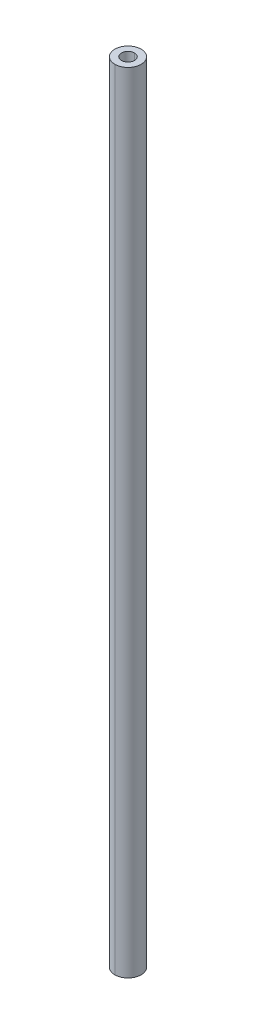
ISO-10303-21;
HEADER;
FILE_DESCRIPTION(('STEP AP214'),'2;1');
FILE_NAME('part.step','',(''),(''),'','','');
FILE_SCHEMA(('AUTOMOTIVE_DESIGN { 1 0 10303 214 1 1 1 1 }'));
ENDSEC;
DATA;
#1=APPLICATION_CONTEXT('core data for automotive mechanical design processes');
#2=APPLICATION_PROTOCOL_DEFINITION('international standard','automotive_design',2000,#1);
#3=PRODUCT_CONTEXT('',#1,'mechanical');
#4=PRODUCT('Part','Part','',(#3));
#5=PRODUCT_RELATED_PRODUCT_CATEGORY('part','',(#4));
#6=PRODUCT_DEFINITION_FORMATION('','',#4);
#7=PRODUCT_DEFINITION_CONTEXT('part definition',#1,'design');
#8=PRODUCT_DEFINITION('design','',#6,#7);
#9=PRODUCT_DEFINITION_SHAPE('','',#8);
#10=(LENGTH_UNIT() NAMED_UNIT(*) SI_UNIT(.MILLI.,.METRE.));
#11=(NAMED_UNIT(*) PLANE_ANGLE_UNIT() SI_UNIT($,.RADIAN.));
#12=(NAMED_UNIT(*) SI_UNIT($,.STERADIAN.) SOLID_ANGLE_UNIT());
#13=UNCERTAINTY_MEASURE_WITH_UNIT(LENGTH_MEASURE(1.E-05),#10,'distance_accuracy_value','');
#14=(GEOMETRIC_REPRESENTATION_CONTEXT(3) GLOBAL_UNCERTAINTY_ASSIGNED_CONTEXT((#13)) GLOBAL_UNIT_ASSIGNED_CONTEXT((#10,
#11,#12)) REPRESENTATION_CONTEXT('',''));
#15=CARTESIAN_POINT('',(0.,0.,0.));
#16=DIRECTION('',(0.,0.,1.));
#17=DIRECTION('',(1.,0.,0.));
#18=AXIS2_PLACEMENT_3D('',#15,#16,#17);
#19=CARTESIAN_POINT('',(0.,180.,0.));
#20=DIRECTION('',(0.,-1.,0.));
#21=DIRECTION('',(0.,0.,-1.));
#22=AXIS2_PLACEMENT_3D('',#19,#20,#21);
#23=CYLINDRICAL_SURFACE('',#22,1.5);
#24=DIRECTION('',(0.,-1.,0.));
#25=VECTOR('',#24,1.);
#26=CARTESIAN_POINT('',(0.,180.,1.5));
#27=LINE('',#26,#25);
#28=CARTESIAN_POINT('',(0.,180.,1.5));
#29=VERTEX_POINT('',#28);
#30=CARTESIAN_POINT('',(0.,0.,1.5));
#31=VERTEX_POINT('',#30);
#32=EDGE_CURVE('E59',#29,#31,#27,.T.);
#33=ORIENTED_EDGE('',*,*,#32,.T.);
#34=CARTESIAN_POINT('',(0.,0.,0.));
#35=DIRECTION('',(0.,-1.,0.));
#36=DIRECTION('',(0.,0.,-1.));
#37=AXIS2_PLACEMENT_3D('',#34,#35,#36);
#38=CIRCLE('',#37,1.5);
#39=CARTESIAN_POINT('',(0.,0.,-1.5));
#40=VERTEX_POINT('',#39);
#41=EDGE_CURVE('E69',#31,#40,#38,.T.);
#42=ORIENTED_EDGE('',*,*,#41,.T.);
#43=DIRECTION('',(0.,-1.,0.));
#44=VECTOR('',#43,1.);
#45=CARTESIAN_POINT('',(0.,180.,-1.5));
#46=LINE('',#45,#44);
#47=CARTESIAN_POINT('',(0.,180.,-1.5));
#48=VERTEX_POINT('',#47);
#49=EDGE_CURVE('E54',#40,#48,#46,.F.);
#50=ORIENTED_EDGE('',*,*,#49,.T.);
#51=CARTESIAN_POINT('',(0.,180.,0.));
#52=DIRECTION('',(0.,-1.,0.));
#53=DIRECTION('',(0.,0.,-1.));
#54=AXIS2_PLACEMENT_3D('',#51,#52,#53);
#55=CIRCLE('',#54,1.5);
#56=EDGE_CURVE('E67',#29,#48,#55,.T.);
#57=ORIENTED_EDGE('',*,*,#56,.F.);
#58=EDGE_LOOP('',(#33,#42,#50,#57));
#59=FACE_BOUND('',#58,.T.);
#60=ADVANCED_FACE('F17',(#59),#23,.F.);
#61=CARTESIAN_POINT('',(0.,180.,0.));
#62=DIRECTION('',(0.,-1.,0.));
#63=DIRECTION('',(0.,0.,-1.));
#64=AXIS2_PLACEMENT_3D('',#61,#62,#63);
#65=CYLINDRICAL_SURFACE('',#64,1.5);
#66=CARTESIAN_POINT('',(0.,180.,0.));
#67=DIRECTION('',(0.,-1.,0.));
#68=DIRECTION('',(0.,0.,-1.));
#69=AXIS2_PLACEMENT_3D('',#66,#67,#68);
#70=CIRCLE('',#69,1.5);
#71=EDGE_CURVE('E20',#48,#29,#70,.T.);
#72=ORIENTED_EDGE('',*,*,#71,.F.);
#73=ORIENTED_EDGE('',*,*,#49,.F.);
#74=CARTESIAN_POINT('',(0.,0.,0.));
#75=DIRECTION('',(0.,-1.,0.));
#76=DIRECTION('',(0.,0.,-1.));
#77=AXIS2_PLACEMENT_3D('',#74,#75,#76);
#78=CIRCLE('',#77,1.5);
#79=EDGE_CURVE('E64',#40,#31,#78,.T.);
#80=ORIENTED_EDGE('',*,*,#79,.T.);
#81=ORIENTED_EDGE('',*,*,#32,.F.);
#82=EDGE_LOOP('',(#72,#73,#80,#81));
#83=FACE_BOUND('',#82,.T.);
#84=ADVANCED_FACE('F60',(#83),#65,.F.);
#85=CARTESIAN_POINT('',(0.,180.,0.));
#86=DIRECTION('',(0.,1.,0.));
#87=DIRECTION('',(0.,0.,1.));
#88=AXIS2_PLACEMENT_3D('',#85,#86,#87);
#89=PLANE('',#88);
#90=CARTESIAN_POINT('',(0.,180.,0.));
#91=DIRECTION('',(0.,-1.,0.));
#92=DIRECTION('',(0.,0.,-1.));
#93=AXIS2_PLACEMENT_3D('',#90,#91,#92);
#94=CIRCLE('',#93,3.);
#95=CARTESIAN_POINT('',(0.,180.,-3.));
#96=VERTEX_POINT('',#95);
#97=CARTESIAN_POINT('',(0.,180.,3.));
#98=VERTEX_POINT('',#97);
#99=EDGE_CURVE('E97',#96,#98,#94,.T.);
#100=ORIENTED_EDGE('',*,*,#99,.F.);
#101=CARTESIAN_POINT('',(0.,180.,0.));
#102=DIRECTION('',(0.,-1.,0.));
#103=DIRECTION('',(0.,0.,-1.));
#104=AXIS2_PLACEMENT_3D('',#101,#102,#103);
#105=CIRCLE('',#104,3.);
#106=EDGE_CURVE('E103',#98,#96,#105,.T.);
#107=ORIENTED_EDGE('',*,*,#106,.F.);
#108=EDGE_LOOP('',(#100,#107));
#109=FACE_BOUND('',#108,.T.);
#110=ORIENTED_EDGE('',*,*,#71,.T.);
#111=ORIENTED_EDGE('',*,*,#56,.T.);
#112=EDGE_LOOP('',(#110,#111));
#113=FACE_BOUND('',#112,.T.);
#114=ADVANCED_FACE('F70',(#109,#113),#89,.T.);
#115=CARTESIAN_POINT('',(0.,0.,0.));
#116=DIRECTION('',(0.,1.,0.));
#117=DIRECTION('',(0.,0.,1.));
#118=AXIS2_PLACEMENT_3D('',#115,#116,#117);
#119=PLANE('',#118);
#120=CARTESIAN_POINT('',(0.,0.,0.));
#121=DIRECTION('',(0.,-1.,0.));
#122=DIRECTION('',(0.,0.,-1.));
#123=AXIS2_PLACEMENT_3D('',#120,#121,#122);
#124=CIRCLE('',#123,3.);
#125=CARTESIAN_POINT('',(0.,0.,3.));
#126=VERTEX_POINT('',#125);
#127=CARTESIAN_POINT('',(0.,0.,-3.));
#128=VERTEX_POINT('',#127);
#129=EDGE_CURVE('E26',#126,#128,#124,.F.);
#130=ORIENTED_EDGE('',*,*,#129,.F.);
#131=CARTESIAN_POINT('',(0.,0.,0.));
#132=DIRECTION('',(0.,-1.,0.));
#133=DIRECTION('',(0.,0.,-1.));
#134=AXIS2_PLACEMENT_3D('',#131,#132,#133);
#135=CIRCLE('',#134,3.);
#136=EDGE_CURVE('E34',#128,#126,#135,.F.);
#137=ORIENTED_EDGE('',*,*,#136,.F.);
#138=EDGE_LOOP('',(#130,#137));
#139=FACE_BOUND('',#138,.T.);
#140=ORIENTED_EDGE('',*,*,#41,.F.);
#141=ORIENTED_EDGE('',*,*,#79,.F.);
#142=EDGE_LOOP('',(#140,#141));
#143=FACE_BOUND('',#142,.T.);
#144=ADVANCED_FACE('F72',(#139,#143),#119,.F.);
#145=CARTESIAN_POINT('',(0.,180.,0.));
#146=DIRECTION('',(0.,-1.,0.));
#147=DIRECTION('',(0.,0.,-1.));
#148=AXIS2_PLACEMENT_3D('',#145,#146,#147);
#149=CYLINDRICAL_SURFACE('',#148,3.);
#150=DIRECTION('',(0.,-1.,0.));
#151=VECTOR('',#150,1.);
#152=CARTESIAN_POINT('',(0.,180.,-3.));
#153=LINE('',#152,#151);
#154=EDGE_CURVE('E11',#128,#96,#153,.F.);
#155=ORIENTED_EDGE('',*,*,#154,.F.);
#156=ORIENTED_EDGE('',*,*,#136,.T.);
#157=DIRECTION('',(0.,-1.,0.));
#158=VECTOR('',#157,1.);
#159=CARTESIAN_POINT('',(0.,180.,3.));
#160=LINE('',#159,#158);
#161=EDGE_CURVE('E95',#98,#126,#160,.T.);
#162=ORIENTED_EDGE('',*,*,#161,.F.);
#163=ORIENTED_EDGE('',*,*,#106,.T.);
#164=EDGE_LOOP('',(#155,#156,#162,#163));
#165=FACE_BOUND('',#164,.T.);
#166=ADVANCED_FACE('F80',(#165),#149,.T.);
#167=CARTESIAN_POINT('',(0.,180.,0.));
#168=DIRECTION('',(0.,-1.,0.));
#169=DIRECTION('',(0.,0.,-1.));
#170=AXIS2_PLACEMENT_3D('',#167,#168,#169);
#171=CYLINDRICAL_SURFACE('',#170,3.);
#172=ORIENTED_EDGE('',*,*,#129,.T.);
#173=ORIENTED_EDGE('',*,*,#154,.T.);
#174=ORIENTED_EDGE('',*,*,#99,.T.);
#175=ORIENTED_EDGE('',*,*,#161,.T.);
#176=EDGE_LOOP('',(#172,#173,#174,#175));
#177=FACE_BOUND('',#176,.T.);
#178=ADVANCED_FACE('F82',(#177),#171,.T.);
#179=CLOSED_SHELL('',(#60,#84,#114,#144,#166,#178));
#180=MANIFOLD_SOLID_BREP('B1',#179);
#181=ADVANCED_BREP_SHAPE_REPRESENTATION('',(#18,#180),#14);
#182=SHAPE_DEFINITION_REPRESENTATION(#9,#181);
ENDSEC;
END-ISO-10303-21;
